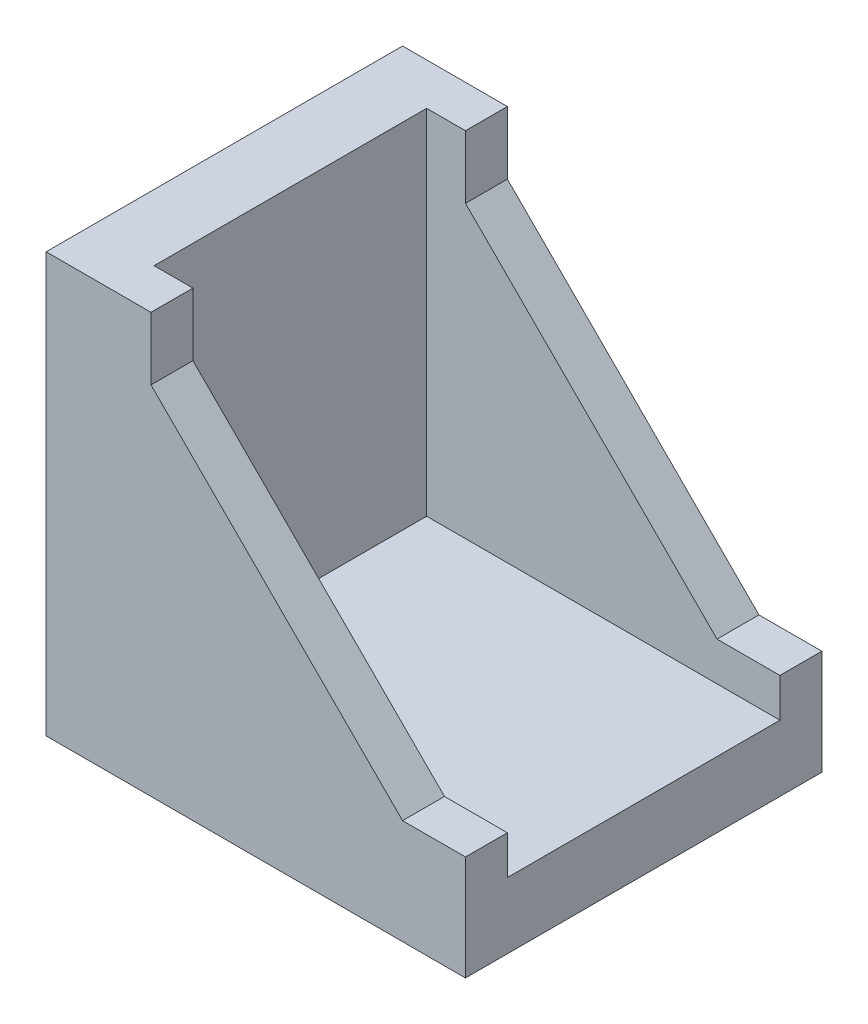
ISO-10303-21;
HEADER;
FILE_DESCRIPTION(('STEP AP214'),'2;1');
FILE_NAME('part.step','',(''),(''),'','','');
FILE_SCHEMA(('AUTOMOTIVE_DESIGN { 1 0 10303 214 1 1 1 1 }'));
ENDSEC;
DATA;
#1=APPLICATION_CONTEXT('core data for automotive mechanical design processes');
#2=APPLICATION_PROTOCOL_DEFINITION('international standard','automotive_design',2000,#1);
#3=PRODUCT_CONTEXT('',#1,'mechanical');
#4=PRODUCT('Part','Part','',(#3));
#5=PRODUCT_RELATED_PRODUCT_CATEGORY('part','',(#4));
#6=PRODUCT_DEFINITION_FORMATION('','',#4);
#7=PRODUCT_DEFINITION_CONTEXT('part definition',#1,'design');
#8=PRODUCT_DEFINITION('design','',#6,#7);
#9=PRODUCT_DEFINITION_SHAPE('','',#8);
#10=(LENGTH_UNIT() NAMED_UNIT(*) SI_UNIT(.MILLI.,.METRE.));
#11=(NAMED_UNIT(*) PLANE_ANGLE_UNIT() SI_UNIT($,.RADIAN.));
#12=(NAMED_UNIT(*) SI_UNIT($,.STERADIAN.) SOLID_ANGLE_UNIT());
#13=UNCERTAINTY_MEASURE_WITH_UNIT(LENGTH_MEASURE(1.E-05),#10,'distance_accuracy_value','');
#14=(GEOMETRIC_REPRESENTATION_CONTEXT(3) GLOBAL_UNCERTAINTY_ASSIGNED_CONTEXT((#13)) GLOBAL_UNIT_ASSIGNED_CONTEXT((#10,
#11,#12)) REPRESENTATION_CONTEXT('',''));
#15=CARTESIAN_POINT('',(0.,0.,0.));
#16=DIRECTION('',(0.,0.,1.));
#17=DIRECTION('',(1.,0.,0.));
#18=AXIS2_PLACEMENT_3D('',#15,#16,#17);
#19=CARTESIAN_POINT('',(20.,5.,17.));
#20=DIRECTION('',(0.,-1.,0.));
#21=DIRECTION('',(0.,0.,-1.));
#22=AXIS2_PLACEMENT_3D('',#19,#20,#21);
#23=PLANE('',#22);
#24=DIRECTION('',(0.,0.,-1.));
#25=VECTOR('',#24,1.);
#26=CARTESIAN_POINT('',(20.,5.,17.));
#27=LINE('',#26,#25);
#28=CARTESIAN_POINT('',(20.,5.,17.));
#29=VERTEX_POINT('',#28);
#30=CARTESIAN_POINT('',(20.,5.,15.));
#31=VERTEX_POINT('',#30);
#32=EDGE_CURVE('E166',#29,#31,#27,.T.);
#33=ORIENTED_EDGE('',*,*,#32,.T.);
#34=DIRECTION('',(-1.,0.,0.));
#35=VECTOR('',#34,1.);
#36=CARTESIAN_POINT('',(20.,5.,15.));
#37=LINE('',#36,#35);
#38=CARTESIAN_POINT('',(17.,5.,15.));
#39=VERTEX_POINT('',#38);
#40=EDGE_CURVE('E144',#31,#39,#37,.T.);
#41=ORIENTED_EDGE('',*,*,#40,.T.);
#42=DIRECTION('',(0.,0.,-1.));
#43=VECTOR('',#42,1.);
#44=CARTESIAN_POINT('',(17.,5.,17.));
#45=LINE('',#44,#43);
#46=CARTESIAN_POINT('',(17.,5.,17.));
#47=VERTEX_POINT('',#46);
#48=EDGE_CURVE('E163',#47,#39,#45,.T.);
#49=ORIENTED_EDGE('',*,*,#48,.F.);
#50=DIRECTION('',(-1.,0.,0.));
#51=VECTOR('',#50,1.);
#52=CARTESIAN_POINT('',(20.,5.,17.));
#53=LINE('',#52,#51);
#54=EDGE_CURVE('E115',#29,#47,#53,.T.);
#55=ORIENTED_EDGE('',*,*,#54,.F.);
#56=EDGE_LOOP('',(#33,#41,#49,#55));
#57=FACE_BOUND('',#56,.T.);
#58=ADVANCED_FACE('F34',(#57),#23,.F.);
#59=CARTESIAN_POINT('',(5.,17.,17.));
#60=DIRECTION('',(-0.707106781186548,-0.707106781186547,0.));
#61=DIRECTION('',(0.707106781186547,-0.707106781186548,0.));
#62=AXIS2_PLACEMENT_3D('',#59,#60,#61);
#63=PLANE('',#62);
#64=ORIENTED_EDGE('',*,*,#48,.T.);
#65=DIRECTION('',(-0.707106781186547,0.707106781186548,0.));
#66=VECTOR('',#65,1.);
#67=CARTESIAN_POINT('',(5.,17.,15.));
#68=LINE('',#67,#66);
#69=CARTESIAN_POINT('',(5.,17.,15.));
#70=VERTEX_POINT('',#69);
#71=EDGE_CURVE('E126',#39,#70,#68,.T.);
#72=ORIENTED_EDGE('',*,*,#71,.T.);
#73=DIRECTION('',(0.,0.,-1.));
#74=VECTOR('',#73,1.);
#75=CARTESIAN_POINT('',(5.,17.,17.));
#76=LINE('',#75,#74);
#77=CARTESIAN_POINT('',(5.,17.,17.));
#78=VERTEX_POINT('',#77);
#79=EDGE_CURVE('E122',#78,#70,#76,.T.);
#80=ORIENTED_EDGE('',*,*,#79,.F.);
#81=DIRECTION('',(-0.707106781186547,0.707106781186548,0.));
#82=VECTOR('',#81,1.);
#83=CARTESIAN_POINT('',(5.,17.,17.));
#84=LINE('',#83,#82);
#85=EDGE_CURVE('E108',#47,#78,#84,.T.);
#86=ORIENTED_EDGE('',*,*,#85,.F.);
#87=EDGE_LOOP('',(#64,#72,#80,#86));
#88=FACE_BOUND('',#87,.T.);
#89=ADVANCED_FACE('F123',(#88),#63,.F.);
#90=CARTESIAN_POINT('',(5.,20.,17.));
#91=DIRECTION('',(-1.,0.,0.));
#92=DIRECTION('',(0.,0.,1.));
#93=AXIS2_PLACEMENT_3D('',#90,#91,#92);
#94=PLANE('',#93);
#95=ORIENTED_EDGE('',*,*,#79,.T.);
#96=DIRECTION('',(0.,1.,0.));
#97=VECTOR('',#96,1.);
#98=CARTESIAN_POINT('',(5.,20.,15.));
#99=LINE('',#98,#97);
#100=CARTESIAN_POINT('',(5.,20.,15.));
#101=VERTEX_POINT('',#100);
#102=EDGE_CURVE('E262',#70,#101,#99,.T.);
#103=ORIENTED_EDGE('',*,*,#102,.T.);
#104=DIRECTION('',(0.,0.,-1.));
#105=VECTOR('',#104,1.);
#106=CARTESIAN_POINT('',(5.,20.,17.));
#107=LINE('',#106,#105);
#108=CARTESIAN_POINT('',(5.,20.,17.));
#109=VERTEX_POINT('',#108);
#110=EDGE_CURVE('E134',#109,#101,#107,.T.);
#111=ORIENTED_EDGE('',*,*,#110,.F.);
#112=DIRECTION('',(0.,1.,0.));
#113=VECTOR('',#112,1.);
#114=CARTESIAN_POINT('',(5.,20.,17.));
#115=LINE('',#114,#113);
#116=EDGE_CURVE('E112',#78,#109,#115,.T.);
#117=ORIENTED_EDGE('',*,*,#116,.F.);
#118=EDGE_LOOP('',(#95,#103,#111,#117));
#119=FACE_BOUND('',#118,.T.);
#120=ADVANCED_FACE('F132',(#119),#94,.F.);
#121=CARTESIAN_POINT('',(0.,0.,17.));
#122=DIRECTION('',(1.,0.,0.));
#123=DIRECTION('',(0.,0.,-1.));
#124=AXIS2_PLACEMENT_3D('',#121,#122,#123);
#125=PLANE('',#124);
#126=DIRECTION('',(0.,-1.,0.));
#127=VECTOR('',#126,1.);
#128=CARTESIAN_POINT('',(0.,0.,0.));
#129=LINE('',#128,#127);
#130=CARTESIAN_POINT('',(0.,20.,0.));
#131=VERTEX_POINT('',#130);
#132=CARTESIAN_POINT('',(0.,0.,0.));
#133=VERTEX_POINT('',#132);
#134=EDGE_CURVE('E140',#131,#133,#129,.T.);
#135=ORIENTED_EDGE('',*,*,#134,.T.);
#136=DIRECTION('',(0.,0.,-1.));
#137=VECTOR('',#136,1.);
#138=CARTESIAN_POINT('',(0.,0.,17.));
#139=LINE('',#138,#137);
#140=CARTESIAN_POINT('',(0.,0.,17.));
#141=VERTEX_POINT('',#140);
#142=EDGE_CURVE('E172',#141,#133,#139,.T.);
#143=ORIENTED_EDGE('',*,*,#142,.F.);
#144=DIRECTION('',(0.,-1.,0.));
#145=VECTOR('',#144,1.);
#146=CARTESIAN_POINT('',(0.,0.,17.));
#147=LINE('',#146,#145);
#148=CARTESIAN_POINT('',(0.,20.,17.));
#149=VERTEX_POINT('',#148);
#150=EDGE_CURVE('E159',#149,#141,#147,.T.);
#151=ORIENTED_EDGE('',*,*,#150,.F.);
#152=DIRECTION('',(0.,0.,-1.));
#153=VECTOR('',#152,1.);
#154=CARTESIAN_POINT('',(0.,20.,17.));
#155=LINE('',#154,#153);
#156=EDGE_CURVE('E136',#149,#131,#155,.T.);
#157=ORIENTED_EDGE('',*,*,#156,.T.);
#158=EDGE_LOOP('',(#135,#143,#151,#157));
#159=FACE_BOUND('',#158,.T.);
#160=ADVANCED_FACE('F36',(#159),#125,.F.);
#161=CARTESIAN_POINT('',(0.,0.,17.));
#162=DIRECTION('',(0.,1.,0.));
#163=DIRECTION('',(0.,0.,1.));
#164=AXIS2_PLACEMENT_3D('',#161,#162,#163);
#165=PLANE('',#164);
#166=DIRECTION('',(1.,0.,0.));
#167=VECTOR('',#166,1.);
#168=CARTESIAN_POINT('',(0.,0.,0.));
#169=LINE('',#168,#167);
#170=CARTESIAN_POINT('',(20.,0.,0.));
#171=VERTEX_POINT('',#170);
#172=EDGE_CURVE('E143',#133,#171,#169,.T.);
#173=ORIENTED_EDGE('',*,*,#172,.T.);
#174=DIRECTION('',(0.,0.,-1.));
#175=VECTOR('',#174,1.);
#176=CARTESIAN_POINT('',(20.,0.,17.));
#177=LINE('',#176,#175);
#178=CARTESIAN_POINT('',(20.,0.,17.));
#179=VERTEX_POINT('',#178);
#180=EDGE_CURVE('E169',#179,#171,#177,.T.);
#181=ORIENTED_EDGE('',*,*,#180,.F.);
#182=DIRECTION('',(1.,0.,0.));
#183=VECTOR('',#182,1.);
#184=CARTESIAN_POINT('',(0.,0.,17.));
#185=LINE('',#184,#183);
#186=EDGE_CURVE('E96',#141,#179,#185,.T.);
#187=ORIENTED_EDGE('',*,*,#186,.F.);
#188=ORIENTED_EDGE('',*,*,#142,.T.);
#189=EDGE_LOOP('',(#173,#181,#187,#188));
#190=FACE_BOUND('',#189,.T.);
#191=ADVANCED_FACE('F291',(#190),#165,.F.);
#192=CARTESIAN_POINT('',(20.,0.,17.));
#193=DIRECTION('',(-1.,0.,0.));
#194=DIRECTION('',(0.,0.,1.));
#195=AXIS2_PLACEMENT_3D('',#192,#193,#194);
#196=PLANE('',#195);
#197=DIRECTION('',(0.,0.,-1.));
#198=VECTOR('',#197,1.);
#199=CARTESIAN_POINT('',(20.,3.15,15.));
#200=LINE('',#199,#198);
#201=CARTESIAN_POINT('',(20.,3.15,15.));
#202=VERTEX_POINT('',#201);
#203=CARTESIAN_POINT('',(20.,3.15,2.));
#204=VERTEX_POINT('',#203);
#205=EDGE_CURVE('E251',#202,#204,#200,.T.);
#206=ORIENTED_EDGE('',*,*,#205,.F.);
#207=DIRECTION('',(0.,-1.,0.));
#208=VECTOR('',#207,1.);
#209=CARTESIAN_POINT('',(20.,3.15,15.));
#210=LINE('',#209,#208);
#211=EDGE_CURVE('E240',#31,#202,#210,.T.);
#212=ORIENTED_EDGE('',*,*,#211,.F.);
#213=ORIENTED_EDGE('',*,*,#32,.F.);
#214=DIRECTION('',(0.,1.,0.));
#215=VECTOR('',#214,1.);
#216=CARTESIAN_POINT('',(20.,0.,17.));
#217=LINE('',#216,#215);
#218=EDGE_CURVE('E269',#179,#29,#217,.T.);
#219=ORIENTED_EDGE('',*,*,#218,.F.);
#220=ORIENTED_EDGE('',*,*,#180,.T.);
#221=DIRECTION('',(0.,1.,0.));
#222=VECTOR('',#221,1.);
#223=CARTESIAN_POINT('',(20.,0.,0.));
#224=LINE('',#223,#222);
#225=CARTESIAN_POINT('',(20.,5.,0.));
#226=VERTEX_POINT('',#225);
#227=EDGE_CURVE('E146',#171,#226,#224,.T.);
#228=ORIENTED_EDGE('',*,*,#227,.T.);
#229=CARTESIAN_POINT('',(20.,5.,2.));
#230=VERTEX_POINT('',#229);
#231=EDGE_CURVE('E165',#230,#226,#27,.T.);
#232=ORIENTED_EDGE('',*,*,#231,.F.);
#233=DIRECTION('',(0.,1.,0.));
#234=VECTOR('',#233,1.);
#235=CARTESIAN_POINT('',(20.,3.15,2.));
#236=LINE('',#235,#234);
#237=EDGE_CURVE('E234',#204,#230,#236,.T.);
#238=ORIENTED_EDGE('',*,*,#237,.F.);
#239=EDGE_LOOP('',(#206,#212,#213,#219,#220,#228,#232,#238));
#240=FACE_BOUND('',#239,.T.);
#241=ADVANCED_FACE('F273',(#240),#196,.F.);
#242=CARTESIAN_POINT('',(17.,5.,2.));
#243=VERTEX_POINT('',#242);
#244=CARTESIAN_POINT('',(17.,5.,0.));
#245=VERTEX_POINT('',#244);
#246=EDGE_CURVE('E129',#243,#245,#45,.T.);
#247=ORIENTED_EDGE('',*,*,#246,.F.);
#248=DIRECTION('',(1.,0.,0.));
#249=VECTOR('',#248,1.);
#250=CARTESIAN_POINT('',(20.,5.,2.));
#251=LINE('',#250,#249);
#252=EDGE_CURVE('E259',#243,#230,#251,.T.);
#253=ORIENTED_EDGE('',*,*,#252,.T.);
#254=ORIENTED_EDGE('',*,*,#231,.T.);
#255=DIRECTION('',(-1.,0.,0.));
#256=VECTOR('',#255,1.);
#257=CARTESIAN_POINT('',(20.,5.,0.));
#258=LINE('',#257,#256);
#259=EDGE_CURVE('E149',#226,#245,#258,.T.);
#260=ORIENTED_EDGE('',*,*,#259,.T.);
#261=EDGE_LOOP('',(#247,#253,#254,#260));
#262=FACE_BOUND('',#261,.T.);
#263=ADVANCED_FACE('F277',(#262),#23,.F.);
#264=CARTESIAN_POINT('',(5.,17.,2.));
#265=VERTEX_POINT('',#264);
#266=CARTESIAN_POINT('',(5.,17.,0.));
#267=VERTEX_POINT('',#266);
#268=EDGE_CURVE('E130',#265,#267,#76,.T.);
#269=ORIENTED_EDGE('',*,*,#268,.F.);
#270=DIRECTION('',(0.707106781186547,-0.707106781186548,0.));
#271=VECTOR('',#270,1.);
#272=CARTESIAN_POINT('',(5.,17.,2.));
#273=LINE('',#272,#271);
#274=EDGE_CURVE('E256',#265,#243,#273,.T.);
#275=ORIENTED_EDGE('',*,*,#274,.T.);
#276=ORIENTED_EDGE('',*,*,#246,.T.);
#277=DIRECTION('',(-0.707106781186547,0.707106781186548,0.));
#278=VECTOR('',#277,1.);
#279=CARTESIAN_POINT('',(5.,17.,0.));
#280=LINE('',#279,#278);
#281=EDGE_CURVE('E152',#245,#267,#280,.T.);
#282=ORIENTED_EDGE('',*,*,#281,.T.);
#283=EDGE_LOOP('',(#269,#275,#276,#282));
#284=FACE_BOUND('',#283,.T.);
#285=ADVANCED_FACE('F282',(#284),#63,.F.);
#286=CARTESIAN_POINT('',(5.,20.,2.));
#287=VERTEX_POINT('',#286);
#288=CARTESIAN_POINT('',(5.,20.,0.));
#289=VERTEX_POINT('',#288);
#290=EDGE_CURVE('E161',#287,#289,#107,.T.);
#291=ORIENTED_EDGE('',*,*,#290,.F.);
#292=DIRECTION('',(0.,-1.,0.));
#293=VECTOR('',#292,1.);
#294=CARTESIAN_POINT('',(5.,20.,2.));
#295=LINE('',#294,#293);
#296=EDGE_CURVE('E188',#287,#265,#295,.T.);
#297=ORIENTED_EDGE('',*,*,#296,.T.);
#298=ORIENTED_EDGE('',*,*,#268,.T.);
#299=DIRECTION('',(0.,1.,0.));
#300=VECTOR('',#299,1.);
#301=CARTESIAN_POINT('',(5.,20.,0.));
#302=LINE('',#301,#300);
#303=EDGE_CURVE('E155',#267,#289,#302,.T.);
#304=ORIENTED_EDGE('',*,*,#303,.T.);
#305=EDGE_LOOP('',(#291,#297,#298,#304));
#306=FACE_BOUND('',#305,.T.);
#307=ADVANCED_FACE('F187',(#306),#94,.F.);
#308=CARTESIAN_POINT('',(0.,20.,17.));
#309=DIRECTION('',(0.,-1.,0.));
#310=DIRECTION('',(0.,0.,-1.));
#311=AXIS2_PLACEMENT_3D('',#308,#309,#310);
#312=PLANE('',#311);
#313=ORIENTED_EDGE('',*,*,#110,.T.);
#314=DIRECTION('',(-1.,0.,0.));
#315=VECTOR('',#314,1.);
#316=CARTESIAN_POINT('',(0.,20.,15.));
#317=LINE('',#316,#315);
#318=CARTESIAN_POINT('',(3.15,20.,15.));
#319=VERTEX_POINT('',#318);
#320=EDGE_CURVE('E11',#101,#319,#317,.T.);
#321=ORIENTED_EDGE('',*,*,#320,.T.);
#322=DIRECTION('',(0.,0.,-1.));
#323=VECTOR('',#322,1.);
#324=CARTESIAN_POINT('',(3.15,20.,17.));
#325=LINE('',#324,#323);
#326=CARTESIAN_POINT('',(3.15,20.,2.));
#327=VERTEX_POINT('',#326);
#328=EDGE_CURVE('E174',#319,#327,#325,.T.);
#329=ORIENTED_EDGE('',*,*,#328,.T.);
#330=DIRECTION('',(1.,0.,0.));
#331=VECTOR('',#330,1.);
#332=CARTESIAN_POINT('',(0.,20.,2.));
#333=LINE('',#332,#331);
#334=EDGE_CURVE('E42',#327,#287,#333,.T.);
#335=ORIENTED_EDGE('',*,*,#334,.T.);
#336=ORIENTED_EDGE('',*,*,#290,.T.);
#337=DIRECTION('',(-1.,0.,0.));
#338=VECTOR('',#337,1.);
#339=CARTESIAN_POINT('',(0.,20.,0.));
#340=LINE('',#339,#338);
#341=EDGE_CURVE('E87',#289,#131,#340,.T.);
#342=ORIENTED_EDGE('',*,*,#341,.T.);
#343=ORIENTED_EDGE('',*,*,#156,.F.);
#344=DIRECTION('',(-1.,0.,0.));
#345=VECTOR('',#344,1.);
#346=CARTESIAN_POINT('',(0.,20.,17.));
#347=LINE('',#346,#345);
#348=EDGE_CURVE('E58',#109,#149,#347,.T.);
#349=ORIENTED_EDGE('',*,*,#348,.F.);
#350=EDGE_LOOP('',(#313,#321,#329,#335,#336,#342,#343,#349));
#351=FACE_BOUND('',#350,.T.);
#352=ADVANCED_FACE('F179',(#351),#312,.F.);
#353=CARTESIAN_POINT('',(0.,0.,17.));
#354=DIRECTION('',(0.,0.,-1.));
#355=DIRECTION('',(-1.,0.,0.));
#356=AXIS2_PLACEMENT_3D('',#353,#354,#355);
#357=PLANE('',#356);
#358=ORIENTED_EDGE('',*,*,#150,.T.);
#359=ORIENTED_EDGE('',*,*,#186,.T.);
#360=ORIENTED_EDGE('',*,*,#218,.T.);
#361=ORIENTED_EDGE('',*,*,#54,.T.);
#362=ORIENTED_EDGE('',*,*,#85,.T.);
#363=ORIENTED_EDGE('',*,*,#116,.T.);
#364=ORIENTED_EDGE('',*,*,#348,.T.);
#365=EDGE_LOOP('',(#358,#359,#360,#361,#362,#363,#364));
#366=FACE_BOUND('',#365,.T.);
#367=ADVANCED_FACE('F110',(#366),#357,.F.);
#368=CARTESIAN_POINT('',(0.,0.,0.));
#369=DIRECTION('',(0.,0.,-1.));
#370=DIRECTION('',(-1.,0.,0.));
#371=AXIS2_PLACEMENT_3D('',#368,#369,#370);
#372=PLANE('',#371);
#373=ORIENTED_EDGE('',*,*,#134,.F.);
#374=ORIENTED_EDGE('',*,*,#341,.F.);
#375=ORIENTED_EDGE('',*,*,#303,.F.);
#376=ORIENTED_EDGE('',*,*,#281,.F.);
#377=ORIENTED_EDGE('',*,*,#259,.F.);
#378=ORIENTED_EDGE('',*,*,#227,.F.);
#379=ORIENTED_EDGE('',*,*,#172,.F.);
#380=EDGE_LOOP('',(#373,#374,#375,#376,#377,#378,#379));
#381=FACE_BOUND('',#380,.T.);
#382=ADVANCED_FACE('F194',(#381),#372,.T.);
#383=CARTESIAN_POINT('',(3.15,3.15,15.));
#384=DIRECTION('',(0.,0.,1.));
#385=DIRECTION('',(1.,0.,0.));
#386=AXIS2_PLACEMENT_3D('',#383,#384,#385);
#387=PLANE('',#386);
#388=ORIENTED_EDGE('',*,*,#211,.T.);
#389=DIRECTION('',(1.,0.,0.));
#390=VECTOR('',#389,1.);
#391=CARTESIAN_POINT('',(3.15,3.15,15.));
#392=LINE('',#391,#390);
#393=CARTESIAN_POINT('',(3.15,3.15,15.));
#394=VERTEX_POINT('',#393);
#395=EDGE_CURVE('E237',#394,#202,#392,.T.);
#396=ORIENTED_EDGE('',*,*,#395,.F.);
#397=DIRECTION('',(0.,-1.,0.));
#398=VECTOR('',#397,1.);
#399=CARTESIAN_POINT('',(3.15,3.15,15.));
#400=LINE('',#399,#398);
#401=EDGE_CURVE('E229',#319,#394,#400,.T.);
#402=ORIENTED_EDGE('',*,*,#401,.F.);
#403=ORIENTED_EDGE('',*,*,#320,.F.);
#404=ORIENTED_EDGE('',*,*,#102,.F.);
#405=ORIENTED_EDGE('',*,*,#71,.F.);
#406=ORIENTED_EDGE('',*,*,#40,.F.);
#407=EDGE_LOOP('',(#388,#396,#402,#403,#404,#405,#406));
#408=FACE_BOUND('',#407,.T.);
#409=ADVANCED_FACE('F238',(#408),#387,.F.);
#410=CARTESIAN_POINT('',(3.15,3.15,2.));
#411=DIRECTION('',(0.,0.,-1.));
#412=DIRECTION('',(0.,1.,0.));
#413=AXIS2_PLACEMENT_3D('',#410,#411,#412);
#414=PLANE('',#413);
#415=ORIENTED_EDGE('',*,*,#274,.F.);
#416=ORIENTED_EDGE('',*,*,#296,.F.);
#417=ORIENTED_EDGE('',*,*,#334,.F.);
#418=DIRECTION('',(0.,1.,0.));
#419=VECTOR('',#418,1.);
#420=CARTESIAN_POINT('',(3.15,3.15,2.));
#421=LINE('',#420,#419);
#422=CARTESIAN_POINT('',(3.15,3.15,2.));
#423=VERTEX_POINT('',#422);
#424=EDGE_CURVE('E49',#423,#327,#421,.T.);
#425=ORIENTED_EDGE('',*,*,#424,.F.);
#426=DIRECTION('',(1.,0.,0.));
#427=VECTOR('',#426,1.);
#428=CARTESIAN_POINT('',(3.15,3.15,2.));
#429=LINE('',#428,#427);
#430=EDGE_CURVE('E244',#423,#204,#429,.T.);
#431=ORIENTED_EDGE('',*,*,#430,.T.);
#432=ORIENTED_EDGE('',*,*,#237,.T.);
#433=ORIENTED_EDGE('',*,*,#252,.F.);
#434=EDGE_LOOP('',(#415,#416,#417,#425,#431,#432,#433));
#435=FACE_BOUND('',#434,.T.);
#436=ADVANCED_FACE('F295',(#435),#414,.F.);
#437=CARTESIAN_POINT('',(3.15,0.,0.));
#438=DIRECTION('',(-1.,0.,0.));
#439=DIRECTION('',(0.,0.,1.));
#440=AXIS2_PLACEMENT_3D('',#437,#438,#439);
#441=PLANE('',#440);
#442=ORIENTED_EDGE('',*,*,#401,.T.);
#443=DIRECTION('',(0.,0.,-1.));
#444=VECTOR('',#443,1.);
#445=CARTESIAN_POINT('',(3.15,3.15,15.));
#446=LINE('',#445,#444);
#447=EDGE_CURVE('E233',#394,#423,#446,.T.);
#448=ORIENTED_EDGE('',*,*,#447,.T.);
#449=ORIENTED_EDGE('',*,*,#424,.T.);
#450=ORIENTED_EDGE('',*,*,#328,.F.);
#451=EDGE_LOOP('',(#442,#448,#449,#450));
#452=FACE_BOUND('',#451,.T.);
#453=ADVANCED_FACE('F231',(#452),#441,.F.);
#454=CARTESIAN_POINT('',(3.15,3.15,15.));
#455=DIRECTION('',(0.,-1.,0.));
#456=DIRECTION('',(0.,0.,-1.));
#457=AXIS2_PLACEMENT_3D('',#454,#455,#456);
#458=PLANE('',#457);
#459=ORIENTED_EDGE('',*,*,#205,.T.);
#460=ORIENTED_EDGE('',*,*,#430,.F.);
#461=ORIENTED_EDGE('',*,*,#447,.F.);
#462=ORIENTED_EDGE('',*,*,#395,.T.);
#463=EDGE_LOOP('',(#459,#460,#461,#462));
#464=FACE_BOUND('',#463,.T.);
#465=ADVANCED_FACE('F246',(#464),#458,.F.);
#466=CLOSED_SHELL('',(#58,#89,#120,#160,#191,#241,#263,#285,#307,#352,#367,#382,#409,#436,#453,#465));
#467=MANIFOLD_SOLID_BREP('B2',#466);
#468=ADVANCED_BREP_SHAPE_REPRESENTATION('',(#18,#467),#14);
#469=SHAPE_DEFINITION_REPRESENTATION(#9,#468);
ENDSEC;
END-ISO-10303-21;
